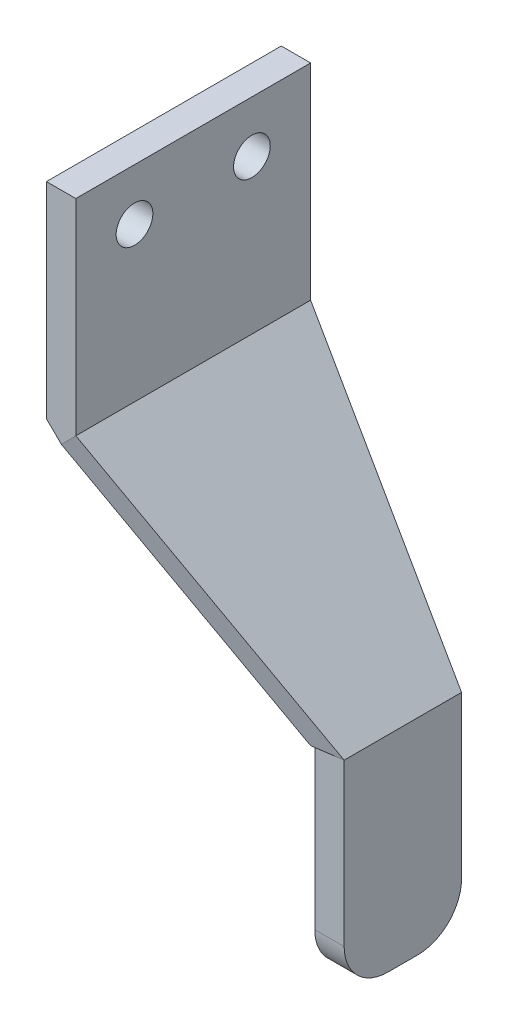
ISO-10303-21;
HEADER;
FILE_DESCRIPTION(('STEP AP214'),'2;1');
FILE_NAME('part.step','',(''),(''),'','','');
FILE_SCHEMA(('AUTOMOTIVE_DESIGN { 1 0 10303 214 1 1 1 1 }'));
ENDSEC;
DATA;
#1=APPLICATION_CONTEXT('core data for automotive mechanical design processes');
#2=APPLICATION_PROTOCOL_DEFINITION('international standard','automotive_design',2000,#1);
#3=PRODUCT_CONTEXT('',#1,'mechanical');
#4=PRODUCT('Part','Part','',(#3));
#5=PRODUCT_RELATED_PRODUCT_CATEGORY('part','',(#4));
#6=PRODUCT_DEFINITION_FORMATION('','',#4);
#7=PRODUCT_DEFINITION_CONTEXT('part definition',#1,'design');
#8=PRODUCT_DEFINITION('design','',#6,#7);
#9=PRODUCT_DEFINITION_SHAPE('','',#8);
#10=(LENGTH_UNIT() NAMED_UNIT(*) SI_UNIT(.MILLI.,.METRE.));
#11=(NAMED_UNIT(*) PLANE_ANGLE_UNIT() SI_UNIT($,.RADIAN.));
#12=(NAMED_UNIT(*) SI_UNIT($,.STERADIAN.) SOLID_ANGLE_UNIT());
#13=UNCERTAINTY_MEASURE_WITH_UNIT(LENGTH_MEASURE(1.E-05),#10,'distance_accuracy_value','');
#14=(GEOMETRIC_REPRESENTATION_CONTEXT(3) GLOBAL_UNCERTAINTY_ASSIGNED_CONTEXT((#13)) GLOBAL_UNIT_ASSIGNED_CONTEXT((#10,
#11,#12)) REPRESENTATION_CONTEXT('',''));
#15=CARTESIAN_POINT('',(0.,0.,0.));
#16=DIRECTION('',(0.,0.,1.));
#17=DIRECTION('',(1.,0.,0.));
#18=AXIS2_PLACEMENT_3D('',#15,#16,#17);
#19=CARTESIAN_POINT('',(0.,0.,8.));
#20=DIRECTION('',(0.,0.,1.));
#21=DIRECTION('',(1.,0.,0.));
#22=AXIS2_PLACEMENT_3D('',#19,#20,#21);
#23=PLANE('',#22);
#24=DIRECTION('',(-0.7,-0.714142842854285,0.));
#25=VECTOR('',#24,1.);
#26=CARTESIAN_POINT('',(-3.42499992855714,3.35717143142914,8.));
#27=LINE('',#26,#25);
#28=CARTESIAN_POINT('',(-3.28499992855714,3.5,8.));
#29=VERTEX_POINT('',#28);
#30=CARTESIAN_POINT('',(-3.77499992855714,3.000100010002,8.));
#31=VERTEX_POINT('',#30);
#32=EDGE_CURVE('E134',#29,#31,#27,.T.);
#33=ORIENTED_EDGE('',*,*,#32,.F.);
#34=DIRECTION('',(0.,-1.,0.));
#35=VECTOR('',#34,1.);
#36=CARTESIAN_POINT('',(-3.28499992855714,10.5,8.));
#37=LINE('',#36,#35);
#38=CARTESIAN_POINT('',(-3.28499992855714,10.5,8.));
#39=VERTEX_POINT('',#38);
#40=EDGE_CURVE('E224',#39,#29,#37,.T.);
#41=ORIENTED_EDGE('',*,*,#40,.F.);
#42=DIRECTION('',(1.,0.,0.));
#43=VECTOR('',#42,1.);
#44=CARTESIAN_POINT('',(-4.28499992855714,10.5,8.));
#45=LINE('',#44,#43);
#46=CARTESIAN_POINT('',(-4.28499992855714,10.5,8.));
#47=VERTEX_POINT('',#46);
#48=EDGE_CURVE('E227',#47,#39,#45,.T.);
#49=ORIENTED_EDGE('',*,*,#48,.F.);
#50=DIRECTION('',(0.,-1.,0.));
#51=VECTOR('',#50,1.);
#52=CARTESIAN_POINT('',(-4.28499992855714,10.5,8.));
#53=LINE('',#52,#51);
#54=CARTESIAN_POINT('',(-4.28499992855714,3.5,8.));
#55=VERTEX_POINT('',#54);
#56=EDGE_CURVE('E231',#47,#55,#53,.T.);
#57=ORIENTED_EDGE('',*,*,#56,.T.);
#58=DIRECTION('',(0.714142842854285,-0.7,0.));
#59=VECTOR('',#58,1.);
#60=CARTESIAN_POINT('',(-4.28499992855714,3.5,8.));
#61=LINE('',#60,#59);
#62=EDGE_CURVE('E233',#55,#31,#61,.T.);
#63=ORIENTED_EDGE('',*,*,#62,.T.);
#64=EDGE_LOOP('',(#33,#41,#49,#57,#63));
#65=FACE_BOUND('',#64,.T.);
#66=ADVANCED_FACE('F37',(#65),#23,.T.);
#67=CARTESIAN_POINT('',(2.85642849998572,-10.5,8.));
#68=DIRECTION('',(0.,1.,0.));
#69=DIRECTION('',(-1.,0.,0.));
#70=AXIS2_PLACEMENT_3D('',#67,#68,#69);
#71=PLANE('',#70);
#72=DIRECTION('',(0.,0.,-1.));
#73=VECTOR('',#72,1.);
#74=CARTESIAN_POINT('',(3.85642849998571,-10.5,8.));
#75=LINE('',#74,#73);
#76=CARTESIAN_POINT('',(3.85642849998571,-10.5,4.49999999999998));
#77=VERTEX_POINT('',#76);
#78=CARTESIAN_POINT('',(3.85642849998571,-10.5,3.49999999999998));
#79=VERTEX_POINT('',#78);
#80=EDGE_CURVE('E165',#77,#79,#75,.T.);
#81=ORIENTED_EDGE('',*,*,#80,.F.);
#82=DIRECTION('',(1.,0.,0.));
#83=VECTOR('',#82,1.);
#84=CARTESIAN_POINT('',(2.85642849998572,-10.5,4.49999999999998));
#85=LINE('',#84,#83);
#86=CARTESIAN_POINT('',(2.85642849998572,-10.5,4.49999999999998));
#87=VERTEX_POINT('',#86);
#88=EDGE_CURVE('E45',#77,#87,#85,.F.);
#89=ORIENTED_EDGE('',*,*,#88,.T.);
#90=DIRECTION('',(0.,0.,-1.));
#91=VECTOR('',#90,1.);
#92=CARTESIAN_POINT('',(2.85642849998572,-10.5,8.));
#93=LINE('',#92,#91);
#94=CARTESIAN_POINT('',(2.85642849998572,-10.5,3.49999999999998));
#95=VERTEX_POINT('',#94);
#96=EDGE_CURVE('E236',#87,#95,#93,.T.);
#97=ORIENTED_EDGE('',*,*,#96,.T.);
#98=DIRECTION('',(1.,0.,0.));
#99=VECTOR('',#98,1.);
#100=CARTESIAN_POINT('',(2.85642849998572,-10.5,3.49999999999998));
#101=LINE('',#100,#99);
#102=EDGE_CURVE('E133',#95,#79,#101,.T.);
#103=ORIENTED_EDGE('',*,*,#102,.T.);
#104=EDGE_LOOP('',(#81,#89,#97,#103));
#105=FACE_BOUND('',#104,.T.);
#106=ADVANCED_FACE('F294',(#105),#71,.F.);
#107=CARTESIAN_POINT('',(3.85642849998571,-10.5,8.));
#108=DIRECTION('',(-1.,0.,0.));
#109=DIRECTION('',(0.,0.,1.));
#110=AXIS2_PLACEMENT_3D('',#107,#108,#109);
#111=PLANE('',#110);
#112=DIRECTION('',(0.,1.,0.));
#113=VECTOR('',#112,1.);
#114=CARTESIAN_POINT('',(3.85642849998571,-3.5,6.));
#115=LINE('',#114,#113);
#116=CARTESIAN_POINT('',(3.85642849998571,-9.,5.99999999999998));
#117=VERTEX_POINT('',#116);
#118=CARTESIAN_POINT('',(3.85642849998572,-3.5,6.));
#119=VERTEX_POINT('',#118);
#120=EDGE_CURVE('E144',#117,#119,#115,.T.);
#121=ORIENTED_EDGE('',*,*,#120,.F.);
#122=CARTESIAN_POINT('',(3.85642849998571,-9.,4.49999999999998));
#123=DIRECTION('',(-1.,0.,0.));
#124=DIRECTION('',(0.,0.,1.));
#125=AXIS2_PLACEMENT_3D('',#122,#123,#124);
#126=CIRCLE('',#125,1.5);
#127=EDGE_CURVE('E59',#117,#77,#126,.F.);
#128=ORIENTED_EDGE('',*,*,#127,.T.);
#129=ORIENTED_EDGE('',*,*,#80,.T.);
#130=CARTESIAN_POINT('',(3.85642849998571,-9.,3.49999999999998));
#131=DIRECTION('',(-1.,0.,0.));
#132=DIRECTION('',(0.,0.,1.));
#133=AXIS2_PLACEMENT_3D('',#130,#131,#132);
#134=CIRCLE('',#133,1.5);
#135=CARTESIAN_POINT('',(3.85642849998571,-8.99999999999999,1.99999999999998));
#136=VERTEX_POINT('',#135);
#137=EDGE_CURVE('E151',#79,#136,#134,.F.);
#138=ORIENTED_EDGE('',*,*,#137,.T.);
#139=DIRECTION('',(0.,-1.,0.));
#140=VECTOR('',#139,1.);
#141=CARTESIAN_POINT('',(3.85642849998571,-3.49999999999999,2.));
#142=LINE('',#141,#140);
#143=CARTESIAN_POINT('',(3.85642849998571,-3.49999999999999,2.));
#144=VERTEX_POINT('',#143);
#145=EDGE_CURVE('E140',#144,#136,#142,.T.);
#146=ORIENTED_EDGE('',*,*,#145,.F.);
#147=DIRECTION('',(0.,0.,-1.));
#148=VECTOR('',#147,1.);
#149=CARTESIAN_POINT('',(3.85642849998571,-3.5,8.));
#150=LINE('',#149,#148);
#151=EDGE_CURVE('E149',#119,#144,#150,.T.);
#152=ORIENTED_EDGE('',*,*,#151,.F.);
#153=EDGE_LOOP('',(#121,#128,#129,#138,#146,#152));
#154=FACE_BOUND('',#153,.T.);
#155=ADVANCED_FACE('F147',(#154),#111,.F.);
#156=CARTESIAN_POINT('',(-3.28499992855714,3.5,8.));
#157=DIRECTION('',(0.7,0.714142842854285,0.));
#158=DIRECTION('',(-0.714142842854285,0.7,0.));
#159=AXIS2_PLACEMENT_3D('',#156,#157,#158);
#160=PLANE('',#159);
#161=DIRECTION('',(-0.700274671385889,0.686406472983644,0.196116135138184));
#162=VECTOR('',#161,1.);
#163=CARTESIAN_POINT('',(-3.28499992855714,3.5,8.));
#164=LINE('',#163,#162);
#165=EDGE_CURVE('E161',#119,#29,#164,.T.);
#166=ORIENTED_EDGE('',*,*,#165,.F.);
#167=ORIENTED_EDGE('',*,*,#151,.T.);
#168=DIRECTION('',(0.70027467138589,-0.686406472983644,0.196116135138184));
#169=VECTOR('',#168,1.);
#170=CARTESIAN_POINT('',(-3.28499992855714,3.5,0.));
#171=LINE('',#170,#169);
#172=CARTESIAN_POINT('',(-3.28499992855714,3.5,0.));
#173=VERTEX_POINT('',#172);
#174=EDGE_CURVE('E154',#173,#144,#171,.T.);
#175=ORIENTED_EDGE('',*,*,#174,.F.);
#176=DIRECTION('',(0.,0.,-1.));
#177=VECTOR('',#176,1.);
#178=CARTESIAN_POINT('',(-3.28499992855714,3.5,8.));
#179=LINE('',#178,#177);
#180=EDGE_CURVE('E166',#29,#173,#179,.T.);
#181=ORIENTED_EDGE('',*,*,#180,.F.);
#182=EDGE_LOOP('',(#166,#167,#175,#181));
#183=FACE_BOUND('',#182,.T.);
#184=ADVANCED_FACE('F164',(#183),#160,.T.);
#185=CARTESIAN_POINT('',(-3.28499992855714,10.5,8.));
#186=DIRECTION('',(1.,0.,0.));
#187=DIRECTION('',(0.,1.,0.));
#188=AXIS2_PLACEMENT_3D('',#185,#186,#187);
#189=PLANE('',#188);
#190=CARTESIAN_POINT('',(-3.28499992855714,8.74462762204116,6.));
#191=DIRECTION('',(1.,0.,0.));
#192=DIRECTION('',(0.,1.,0.));
#193=AXIS2_PLACEMENT_3D('',#190,#191,#192);
#194=CIRCLE('',#193,0.625);
#195=CARTESIAN_POINT('',(-3.28499992855714,9.36962762204116,6.));
#196=VERTEX_POINT('',#195);
#197=EDGE_CURVE('E177',#196,#196,#194,.T.);
#198=ORIENTED_EDGE('',*,*,#197,.F.);
#199=EDGE_LOOP('',(#198));
#200=FACE_BOUND('',#199,.T.);
#201=CARTESIAN_POINT('',(-3.28499992855714,8.74462762204116,2.));
#202=DIRECTION('',(1.,0.,0.));
#203=DIRECTION('',(0.,1.,0.));
#204=AXIS2_PLACEMENT_3D('',#201,#202,#203);
#205=CIRCLE('',#204,0.625);
#206=CARTESIAN_POINT('',(-3.28499992855714,9.36962762204116,2.));
#207=VERTEX_POINT('',#206);
#208=EDGE_CURVE('E219',#207,#207,#205,.T.);
#209=ORIENTED_EDGE('',*,*,#208,.F.);
#210=EDGE_LOOP('',(#209));
#211=FACE_BOUND('',#210,.T.);
#212=DIRECTION('',(0.,-1.,0.));
#213=VECTOR('',#212,1.);
#214=CARTESIAN_POINT('',(-3.28499992855714,10.5,0.));
#215=LINE('',#214,#213);
#216=CARTESIAN_POINT('',(-3.28499992855714,10.5,0.));
#217=VERTEX_POINT('',#216);
#218=EDGE_CURVE('E180',#217,#173,#215,.T.);
#219=ORIENTED_EDGE('',*,*,#218,.F.);
#220=DIRECTION('',(0.,0.,-1.));
#221=VECTOR('',#220,1.);
#222=CARTESIAN_POINT('',(-3.28499992855714,10.5,8.));
#223=LINE('',#222,#221);
#224=EDGE_CURVE('E169',#39,#217,#223,.T.);
#225=ORIENTED_EDGE('',*,*,#224,.F.);
#226=ORIENTED_EDGE('',*,*,#40,.T.);
#227=ORIENTED_EDGE('',*,*,#180,.T.);
#228=EDGE_LOOP('',(#219,#225,#226,#227));
#229=FACE_BOUND('',#228,.T.);
#230=ADVANCED_FACE('F262',(#200,#211,#229),#189,.T.);
#231=CARTESIAN_POINT('',(-4.28499992855714,10.5,8.));
#232=DIRECTION('',(0.,1.,0.));
#233=DIRECTION('',(0.,0.,1.));
#234=AXIS2_PLACEMENT_3D('',#231,#232,#233);
#235=PLANE('',#234);
#236=DIRECTION('',(1.,0.,0.));
#237=VECTOR('',#236,1.);
#238=CARTESIAN_POINT('',(-4.28499992855714,10.5,0.));
#239=LINE('',#238,#237);
#240=CARTESIAN_POINT('',(-4.28499992855714,10.5,0.));
#241=VERTEX_POINT('',#240);
#242=EDGE_CURVE('E239',#241,#217,#239,.T.);
#243=ORIENTED_EDGE('',*,*,#242,.F.);
#244=DIRECTION('',(0.,0.,-1.));
#245=VECTOR('',#244,1.);
#246=CARTESIAN_POINT('',(-4.28499992855714,10.5,8.));
#247=LINE('',#246,#245);
#248=EDGE_CURVE('E254',#47,#241,#247,.T.);
#249=ORIENTED_EDGE('',*,*,#248,.F.);
#250=ORIENTED_EDGE('',*,*,#48,.T.);
#251=ORIENTED_EDGE('',*,*,#224,.T.);
#252=EDGE_LOOP('',(#243,#249,#250,#251));
#253=FACE_BOUND('',#252,.T.);
#254=ADVANCED_FACE('F258',(#253),#235,.T.);
#255=CARTESIAN_POINT('',(-4.28499992855714,10.5,8.));
#256=DIRECTION('',(1.,0.,0.));
#257=DIRECTION('',(0.,1.,0.));
#258=AXIS2_PLACEMENT_3D('',#255,#256,#257);
#259=PLANE('',#258);
#260=CARTESIAN_POINT('',(-4.28499992855714,8.74462762204116,6.));
#261=DIRECTION('',(1.,0.,0.));
#262=DIRECTION('',(0.,1.,0.));
#263=AXIS2_PLACEMENT_3D('',#260,#261,#262);
#264=CIRCLE('',#263,0.625);
#265=CARTESIAN_POINT('',(-4.28499992855714,9.36962762204116,6.));
#266=VERTEX_POINT('',#265);
#267=EDGE_CURVE('E176',#266,#266,#264,.T.);
#268=ORIENTED_EDGE('',*,*,#267,.T.);
#269=EDGE_LOOP('',(#268));
#270=FACE_BOUND('',#269,.T.);
#271=CARTESIAN_POINT('',(-4.28499992855714,8.74462762204116,2.));
#272=DIRECTION('',(1.,0.,0.));
#273=DIRECTION('',(0.,1.,0.));
#274=AXIS2_PLACEMENT_3D('',#271,#272,#273);
#275=CIRCLE('',#274,0.625);
#276=CARTESIAN_POINT('',(-4.28499992855714,9.36962762204116,2.));
#277=VERTEX_POINT('',#276);
#278=EDGE_CURVE('E173',#277,#277,#275,.T.);
#279=ORIENTED_EDGE('',*,*,#278,.T.);
#280=EDGE_LOOP('',(#279));
#281=FACE_BOUND('',#280,.T.);
#282=DIRECTION('',(0.,-1.,0.));
#283=VECTOR('',#282,1.);
#284=CARTESIAN_POINT('',(-4.28499992855714,10.5,0.));
#285=LINE('',#284,#283);
#286=CARTESIAN_POINT('',(-4.28499992855714,3.5,0.));
#287=VERTEX_POINT('',#286);
#288=EDGE_CURVE('E242',#241,#287,#285,.T.);
#289=ORIENTED_EDGE('',*,*,#288,.T.);
#290=DIRECTION('',(0.,0.,-1.));
#291=VECTOR('',#290,1.);
#292=CARTESIAN_POINT('',(-4.28499992855714,3.5,8.));
#293=LINE('',#292,#291);
#294=EDGE_CURVE('E251',#55,#287,#293,.T.);
#295=ORIENTED_EDGE('',*,*,#294,.F.);
#296=ORIENTED_EDGE('',*,*,#56,.F.);
#297=ORIENTED_EDGE('',*,*,#248,.T.);
#298=EDGE_LOOP('',(#289,#295,#296,#297));
#299=FACE_BOUND('',#298,.T.);
#300=ADVANCED_FACE('F269',(#270,#281,#299),#259,.F.);
#301=CARTESIAN_POINT('',(-4.28499992855714,3.5,8.));
#302=DIRECTION('',(0.7,0.714142842854285,0.));
#303=DIRECTION('',(-0.714142842854285,0.7,0.));
#304=AXIS2_PLACEMENT_3D('',#301,#302,#303);
#305=PLANE('',#304);
#306=DIRECTION('',(0.,0.,-1.));
#307=VECTOR('',#306,1.);
#308=CARTESIAN_POINT('',(2.85642849998571,-3.5,8.));
#309=LINE('',#308,#307);
#310=CARTESIAN_POINT('',(2.85642849998571,-3.5,6.14282856857086));
#311=VERTEX_POINT('',#310);
#312=CARTESIAN_POINT('',(2.85642849998572,-3.5,6.));
#313=VERTEX_POINT('',#312);
#314=EDGE_CURVE('E248',#311,#313,#309,.T.);
#315=ORIENTED_EDGE('',*,*,#314,.F.);
#316=DIRECTION('',(-0.70027467138589,0.686406472983644,0.196116135138184));
#317=VECTOR('',#316,1.);
#318=CARTESIAN_POINT('',(-4.26538454394175,3.48077307730777,8.13733516208736));
#319=LINE('',#318,#317);
#320=EDGE_CURVE('E216',#311,#31,#319,.T.);
#321=ORIENTED_EDGE('',*,*,#320,.T.);
#322=ORIENTED_EDGE('',*,*,#62,.F.);
#323=ORIENTED_EDGE('',*,*,#294,.T.);
#324=DIRECTION('',(0.714142842854285,-0.7,0.));
#325=VECTOR('',#324,1.);
#326=CARTESIAN_POINT('',(-4.28499992855714,3.5,0.));
#327=LINE('',#326,#325);
#328=CARTESIAN_POINT('',(-3.77499992855714,3.000100010002,0.));
#329=VERTEX_POINT('',#328);
#330=EDGE_CURVE('E228',#287,#329,#327,.T.);
#331=ORIENTED_EDGE('',*,*,#330,.T.);
#332=DIRECTION('',(0.70027467138589,-0.686406472983644,0.196116135138184));
#333=VECTOR('',#332,1.);
#334=CARTESIAN_POINT('',(-3.16670324724285,2.40385000038469,0.170357145604948));
#335=LINE('',#334,#333);
#336=CARTESIAN_POINT('',(2.85642849998571,-3.5,1.85717143142915));
#337=VERTEX_POINT('',#336);
#338=EDGE_CURVE('E213',#329,#337,#335,.T.);
#339=ORIENTED_EDGE('',*,*,#338,.T.);
#340=DIRECTION('',(0.,0.,1.));
#341=VECTOR('',#340,1.);
#342=CARTESIAN_POINT('',(2.85642849998571,-3.5,8.));
#343=LINE('',#342,#341);
#344=CARTESIAN_POINT('',(2.85642849998572,-3.49999999999999,2.));
#345=VERTEX_POINT('',#344);
#346=EDGE_CURVE('E129',#337,#345,#343,.T.);
#347=ORIENTED_EDGE('',*,*,#346,.T.);
#348=EDGE_CURVE('E247',#313,#345,#309,.T.);
#349=ORIENTED_EDGE('',*,*,#348,.F.);
#350=EDGE_LOOP('',(#315,#321,#322,#323,#331,#339,#347,#349));
#351=FACE_BOUND('',#350,.T.);
#352=ADVANCED_FACE('F274',(#351),#305,.F.);
#353=CARTESIAN_POINT('',(2.85642849998571,-3.5,8.));
#354=DIRECTION('',(1.,0.,0.));
#355=DIRECTION('',(0.,1.,0.));
#356=AXIS2_PLACEMENT_3D('',#353,#354,#355);
#357=PLANE('',#356);
#358=ORIENTED_EDGE('',*,*,#96,.F.);
#359=CARTESIAN_POINT('',(2.85642849998572,-9.,4.49999999999998));
#360=DIRECTION('',(1.,0.,0.));
#361=DIRECTION('',(0.,1.,0.));
#362=AXIS2_PLACEMENT_3D('',#359,#360,#361);
#363=CIRCLE('',#362,1.5);
#364=CARTESIAN_POINT('',(2.85642849998572,-9.00000000000001,5.99999999999998));
#365=VERTEX_POINT('',#364);
#366=EDGE_CURVE('E11',#87,#365,#363,.F.);
#367=ORIENTED_EDGE('',*,*,#366,.T.);
#368=DIRECTION('',(0.,1.,0.));
#369=VECTOR('',#368,1.);
#370=CARTESIAN_POINT('',(2.85642849998571,-3.49999999999999,6.));
#371=LINE('',#370,#369);
#372=EDGE_CURVE('E200',#365,#313,#371,.T.);
#373=ORIENTED_EDGE('',*,*,#372,.T.);
#374=ORIENTED_EDGE('',*,*,#348,.T.);
#375=DIRECTION('',(0.,-1.,0.));
#376=VECTOR('',#375,1.);
#377=CARTESIAN_POINT('',(2.85642849998571,-3.49999999999998,2.));
#378=LINE('',#377,#376);
#379=CARTESIAN_POINT('',(2.85642849998572,-8.99999999999999,1.99999999999998));
#380=VERTEX_POINT('',#379);
#381=EDGE_CURVE('E143',#345,#380,#378,.T.);
#382=ORIENTED_EDGE('',*,*,#381,.T.);
#383=CARTESIAN_POINT('',(2.85642849998572,-9.,3.49999999999998));
#384=DIRECTION('',(1.,0.,0.));
#385=DIRECTION('',(0.,1.,0.));
#386=AXIS2_PLACEMENT_3D('',#383,#384,#385);
#387=CIRCLE('',#386,1.5);
#388=EDGE_CURVE('E188',#380,#95,#387,.F.);
#389=ORIENTED_EDGE('',*,*,#388,.T.);
#390=EDGE_LOOP('',(#358,#367,#373,#374,#382,#389));
#391=FACE_BOUND('',#390,.T.);
#392=ADVANCED_FACE('F285',(#391),#357,.F.);
#393=CARTESIAN_POINT('',(0.,0.,0.));
#394=DIRECTION('',(0.,0.,1.));
#395=DIRECTION('',(1.,0.,0.));
#396=AXIS2_PLACEMENT_3D('',#393,#394,#395);
#397=PLANE('',#396);
#398=ORIENTED_EDGE('',*,*,#218,.T.);
#399=DIRECTION('',(-0.7,-0.714142842854285,0.));
#400=VECTOR('',#399,1.);
#401=CARTESIAN_POINT('',(-3.42499992855714,3.35717143142914,0.));
#402=LINE('',#401,#400);
#403=EDGE_CURVE('E157',#173,#329,#402,.T.);
#404=ORIENTED_EDGE('',*,*,#403,.T.);
#405=ORIENTED_EDGE('',*,*,#330,.F.);
#406=ORIENTED_EDGE('',*,*,#288,.F.);
#407=ORIENTED_EDGE('',*,*,#242,.T.);
#408=EDGE_LOOP('',(#398,#404,#405,#406,#407));
#409=FACE_BOUND('',#408,.T.);
#410=ADVANCED_FACE('F265',(#409),#397,.F.);
#411=CARTESIAN_POINT('',(-11.2849999285571,8.74462762204116,2.));
#412=DIRECTION('',(1.,0.,0.));
#413=DIRECTION('',(0.,1.,0.));
#414=AXIS2_PLACEMENT_3D('',#411,#412,#413);
#415=CYLINDRICAL_SURFACE('',#414,0.625);
#416=ORIENTED_EDGE('',*,*,#208,.T.);
#417=EDGE_LOOP('',(#416));
#418=FACE_BOUND('',#417,.T.);
#419=ORIENTED_EDGE('',*,*,#278,.F.);
#420=EDGE_LOOP('',(#419));
#421=FACE_BOUND('',#420,.T.);
#422=ADVANCED_FACE('F302',(#418,#421),#415,.F.);
#423=CARTESIAN_POINT('',(-11.2849999285571,8.74462762204116,6.));
#424=DIRECTION('',(1.,0.,0.));
#425=DIRECTION('',(0.,1.,0.));
#426=AXIS2_PLACEMENT_3D('',#423,#424,#425);
#427=CYLINDRICAL_SURFACE('',#426,0.625);
#428=ORIENTED_EDGE('',*,*,#197,.T.);
#429=EDGE_LOOP('',(#428));
#430=FACE_BOUND('',#429,.T.);
#431=ORIENTED_EDGE('',*,*,#267,.F.);
#432=EDGE_LOOP('',(#431));
#433=FACE_BOUND('',#432,.T.);
#434=ADVANCED_FACE('F361',(#430,#433),#427,.F.);
#435=CARTESIAN_POINT('',(-8.88499992855714,-2.21314274283428,0.));
#436=DIRECTION('',(-0.140054934277178,0.137281294596729,0.98058067569092));
#437=DIRECTION('',(0.9899534534829,0.,0.141393634712739));
#438=AXIS2_PLACEMENT_3D('',#435,#436,#437);
#439=PLANE('',#438);
#440=ORIENTED_EDGE('',*,*,#174,.T.);
#441=DIRECTION('',(-0.9899534534829,0.,-0.141393634712739));
#442=VECTOR('',#441,1.);
#443=CARTESIAN_POINT('',(-8.91021748755306,-3.5,0.176558228148962));
#444=LINE('',#443,#442);
#445=EDGE_CURVE('E124',#144,#337,#444,.T.);
#446=ORIENTED_EDGE('',*,*,#445,.T.);
#447=ORIENTED_EDGE('',*,*,#338,.F.);
#448=ORIENTED_EDGE('',*,*,#403,.F.);
#449=EDGE_LOOP('',(#440,#446,#447,#448));
#450=FACE_BOUND('',#449,.T.);
#451=ADVANCED_FACE('F155',(#450),#439,.F.);
#452=CARTESIAN_POINT('',(-8.88499992855714,-2.21314274283428,8.));
#453=DIRECTION('',(-0.140054934277178,0.137281294596729,-0.98058067569092));
#454=DIRECTION('',(-0.9899534534829,0.,0.141393634712739));
#455=AXIS2_PLACEMENT_3D('',#452,#453,#454);
#456=PLANE('',#455);
#457=ORIENTED_EDGE('',*,*,#320,.F.);
#458=DIRECTION('',(0.9899534534829,0.,-0.141393634712739));
#459=VECTOR('',#458,1.);
#460=CARTESIAN_POINT('',(-8.91021748755306,-3.5,7.82344177185104));
#461=LINE('',#460,#459);
#462=EDGE_CURVE('E208',#311,#119,#461,.T.);
#463=ORIENTED_EDGE('',*,*,#462,.T.);
#464=ORIENTED_EDGE('',*,*,#165,.T.);
#465=ORIENTED_EDGE('',*,*,#32,.T.);
#466=EDGE_LOOP('',(#457,#463,#464,#465));
#467=FACE_BOUND('',#466,.T.);
#468=ADVANCED_FACE('F279',(#467),#456,.F.);
#469=CARTESIAN_POINT('',(-4.14357150001429,-3.5,8.));
#470=DIRECTION('',(0.,1.,0.));
#471=DIRECTION('',(0.,0.,1.));
#472=AXIS2_PLACEMENT_3D('',#469,#470,#471);
#473=PLANE('',#472);
#474=DIRECTION('',(1.,0.,0.));
#475=VECTOR('',#474,1.);
#476=CARTESIAN_POINT('',(-4.14357150001429,-3.5,6.));
#477=LINE('',#476,#475);
#478=EDGE_CURVE('E203',#313,#119,#477,.T.);
#479=ORIENTED_EDGE('',*,*,#478,.T.);
#480=ORIENTED_EDGE('',*,*,#462,.F.);
#481=ORIENTED_EDGE('',*,*,#314,.T.);
#482=EDGE_LOOP('',(#479,#480,#481));
#483=FACE_BOUND('',#482,.T.);
#484=ADVANCED_FACE('F281',(#483),#473,.F.);
#485=CARTESIAN_POINT('',(-4.14357150001429,-3.5,6.));
#486=DIRECTION('',(0.,0.,-1.));
#487=DIRECTION('',(0.,1.,0.));
#488=AXIS2_PLACEMENT_3D('',#485,#486,#487);
#489=PLANE('',#488);
#490=ORIENTED_EDGE('',*,*,#372,.F.);
#491=DIRECTION('',(1.,0.,0.));
#492=VECTOR('',#491,1.);
#493=CARTESIAN_POINT('',(-4.14357150001428,-9.00000000000002,5.99999999999998));
#494=LINE('',#493,#492);
#495=EDGE_CURVE('E191',#365,#117,#494,.T.);
#496=ORIENTED_EDGE('',*,*,#495,.T.);
#497=ORIENTED_EDGE('',*,*,#120,.T.);
#498=ORIENTED_EDGE('',*,*,#478,.F.);
#499=EDGE_LOOP('',(#490,#496,#497,#498));
#500=FACE_BOUND('',#499,.T.);
#501=ADVANCED_FACE('F197',(#500),#489,.F.);
#502=CARTESIAN_POINT('',(-4.14357150001429,-3.49999999999999,2.));
#503=DIRECTION('',(0.,1.,0.));
#504=DIRECTION('',(0.,0.,1.));
#505=AXIS2_PLACEMENT_3D('',#502,#503,#504);
#506=PLANE('',#505);
#507=ORIENTED_EDGE('',*,*,#445,.F.);
#508=DIRECTION('',(1.,0.,0.));
#509=VECTOR('',#508,1.);
#510=CARTESIAN_POINT('',(-4.14357150001429,-3.49999999999999,2.));
#511=LINE('',#510,#509);
#512=EDGE_CURVE('E127',#345,#144,#511,.T.);
#513=ORIENTED_EDGE('',*,*,#512,.F.);
#514=ORIENTED_EDGE('',*,*,#346,.F.);
#515=EDGE_LOOP('',(#507,#513,#514));
#516=FACE_BOUND('',#515,.T.);
#517=ADVANCED_FACE('F126',(#516),#506,.F.);
#518=CARTESIAN_POINT('',(-4.14357150001429,-3.49999999999999,2.));
#519=DIRECTION('',(0.,0.,1.));
#520=DIRECTION('',(0.,-1.,0.));
#521=AXIS2_PLACEMENT_3D('',#518,#519,#520);
#522=PLANE('',#521);
#523=ORIENTED_EDGE('',*,*,#145,.T.);
#524=DIRECTION('',(1.,0.,0.));
#525=VECTOR('',#524,1.);
#526=CARTESIAN_POINT('',(-4.14357150001428,-9.00000000000001,1.99999999999998));
#527=LINE('',#526,#525);
#528=EDGE_CURVE('E186',#136,#380,#527,.F.);
#529=ORIENTED_EDGE('',*,*,#528,.T.);
#530=ORIENTED_EDGE('',*,*,#381,.F.);
#531=ORIENTED_EDGE('',*,*,#512,.T.);
#532=EDGE_LOOP('',(#523,#529,#530,#531));
#533=FACE_BOUND('',#532,.T.);
#534=ADVANCED_FACE('F139',(#533),#522,.F.);
#535=CARTESIAN_POINT('',(2.85642849998571,-9.,3.49999999999998));
#536=DIRECTION('',(1.,0.,0.));
#537=DIRECTION('',(0.,1.,0.));
#538=AXIS2_PLACEMENT_3D('',#535,#536,#537);
#539=CYLINDRICAL_SURFACE('',#538,1.5);
#540=ORIENTED_EDGE('',*,*,#388,.F.);
#541=ORIENTED_EDGE('',*,*,#528,.F.);
#542=ORIENTED_EDGE('',*,*,#137,.F.);
#543=ORIENTED_EDGE('',*,*,#102,.F.);
#544=EDGE_LOOP('',(#540,#541,#542,#543));
#545=FACE_BOUND('',#544,.T.);
#546=ADVANCED_FACE('F288',(#545),#539,.T.);
#547=CARTESIAN_POINT('',(-4.14357150001428,-9.00000000000001,4.49999999999998));
#548=DIRECTION('',(1.,0.,0.));
#549=DIRECTION('',(0.,1.,0.));
#550=AXIS2_PLACEMENT_3D('',#547,#548,#549);
#551=CYLINDRICAL_SURFACE('',#550,1.5);
#552=ORIENTED_EDGE('',*,*,#366,.F.);
#553=ORIENTED_EDGE('',*,*,#88,.F.);
#554=ORIENTED_EDGE('',*,*,#127,.F.);
#555=ORIENTED_EDGE('',*,*,#495,.F.);
#556=EDGE_LOOP('',(#552,#553,#554,#555));
#557=FACE_BOUND('',#556,.T.);
#558=ADVANCED_FACE('F39',(#557),#551,.T.);
#559=CLOSED_SHELL('',(#66,#106,#155,#184,#230,#254,#300,#352,#392,#410,#422,#434,#451,#468,#484,
#501,#517,#534,#546,#558));
#560=MANIFOLD_SOLID_BREP('B2',#559);
#561=ADVANCED_BREP_SHAPE_REPRESENTATION('',(#18,#560),#14);
#562=SHAPE_DEFINITION_REPRESENTATION(#9,#561);
ENDSEC;
END-ISO-10303-21;
